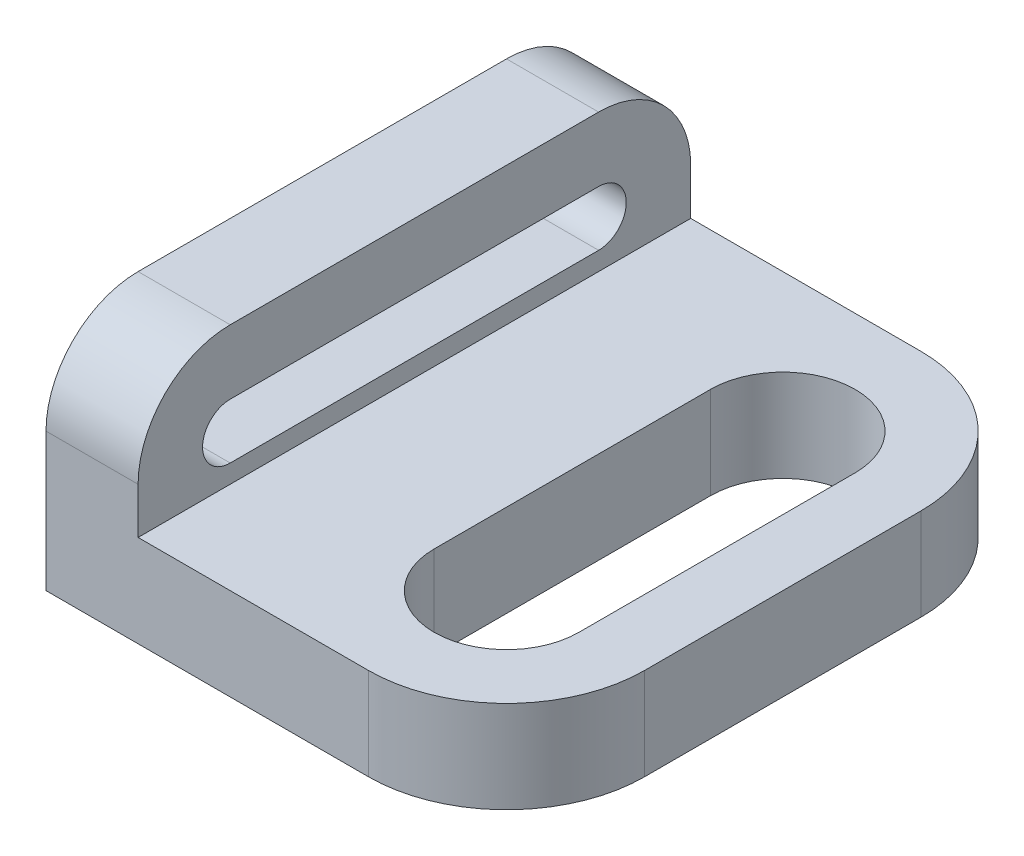
ISO-10303-21;
HEADER;
FILE_DESCRIPTION(('STEP AP214'),'2;1');
FILE_NAME('part.step','',(''),(''),'','','');
FILE_SCHEMA(('AUTOMOTIVE_DESIGN { 1 0 10303 214 1 1 1 1 }'));
ENDSEC;
DATA;
#1=APPLICATION_CONTEXT('core data for automotive mechanical design processes');
#2=APPLICATION_PROTOCOL_DEFINITION('international standard','automotive_design',2000,#1);
#3=PRODUCT_CONTEXT('',#1,'mechanical');
#4=PRODUCT('Part','Part','',(#3));
#5=PRODUCT_RELATED_PRODUCT_CATEGORY('part','',(#4));
#6=PRODUCT_DEFINITION_FORMATION('','',#4);
#7=PRODUCT_DEFINITION_CONTEXT('part definition',#1,'design');
#8=PRODUCT_DEFINITION('design','',#6,#7);
#9=PRODUCT_DEFINITION_SHAPE('','',#8);
#10=(LENGTH_UNIT() NAMED_UNIT(*) SI_UNIT(.MILLI.,.METRE.));
#11=(NAMED_UNIT(*) PLANE_ANGLE_UNIT() SI_UNIT($,.RADIAN.));
#12=(NAMED_UNIT(*) SI_UNIT($,.STERADIAN.) SOLID_ANGLE_UNIT());
#13=UNCERTAINTY_MEASURE_WITH_UNIT(LENGTH_MEASURE(1.E-05),#10,'distance_accuracy_value','');
#14=(GEOMETRIC_REPRESENTATION_CONTEXT(3) GLOBAL_UNCERTAINTY_ASSIGNED_CONTEXT((#13)) GLOBAL_UNIT_ASSIGNED_CONTEXT((#10,
#11,#12)) REPRESENTATION_CONTEXT('',''));
#15=CARTESIAN_POINT('',(0.,0.,0.));
#16=DIRECTION('',(0.,0.,1.));
#17=DIRECTION('',(1.,0.,0.));
#18=AXIS2_PLACEMENT_3D('',#15,#16,#17);
#19=CARTESIAN_POINT('',(0.,20.,-41.2149532710281));
#20=DIRECTION('',(0.,0.,-1.));
#21=DIRECTION('',(-1.,0.,0.));
#22=AXIS2_PLACEMENT_3D('',#19,#20,#21);
#23=PLANE('',#22);
#24=DIRECTION('',(0.,-1.,0.));
#25=VECTOR('',#24,1.);
#26=CARTESIAN_POINT('',(-64.018691588785,20.,-41.2149532710281));
#27=LINE('',#26,#25);
#28=CARTESIAN_POINT('',(-64.018691588785,30.,-41.2149532710281));
#29=VERTEX_POINT('',#28);
#30=CARTESIAN_POINT('',(-64.018691588785,0.,-41.2149532710281));
#31=VERTEX_POINT('',#30);
#32=EDGE_CURVE('E252',#29,#31,#27,.T.);
#33=ORIENTED_EDGE('',*,*,#32,.F.);
#34=DIRECTION('',(1.,0.,0.));
#35=VECTOR('',#34,1.);
#36=CARTESIAN_POINT('',(-44.018691588785,30.,-41.2149532710281));
#37=LINE('',#36,#35);
#38=CARTESIAN_POINT('',(-44.018691588785,30.,-41.2149532710281));
#39=VERTEX_POINT('',#38);
#40=EDGE_CURVE('E282',#29,#39,#37,.T.);
#41=ORIENTED_EDGE('',*,*,#40,.T.);
#42=DIRECTION('',(0.,-1.,0.));
#43=VECTOR('',#42,1.);
#44=CARTESIAN_POINT('',(-44.018691588785,50.,-41.2149532710281));
#45=LINE('',#44,#43);
#46=CARTESIAN_POINT('',(-44.018691588785,20.,-41.2149532710281));
#47=VERTEX_POINT('',#46);
#48=EDGE_CURVE('E202',#39,#47,#45,.T.);
#49=ORIENTED_EDGE('',*,*,#48,.T.);
#50=DIRECTION('',(1.,0.,0.));
#51=VECTOR('',#50,1.);
#52=CARTESIAN_POINT('',(0.,20.,-41.2149532710281));
#53=LINE('',#52,#51);
#54=CARTESIAN_POINT('',(5.98130841121499,20.,-41.2149532710281));
#55=VERTEX_POINT('',#54);
#56=EDGE_CURVE('E222',#47,#55,#53,.T.);
#57=ORIENTED_EDGE('',*,*,#56,.T.);
#58=DIRECTION('',(0.,-1.,0.));
#59=VECTOR('',#58,1.);
#60=CARTESIAN_POINT('',(5.98130841121499,20.,-41.2149532710281));
#61=LINE('',#60,#59);
#62=CARTESIAN_POINT('',(5.98130841121499,0.,-41.2149532710281));
#63=VERTEX_POINT('',#62);
#64=EDGE_CURVE('E255',#55,#63,#61,.T.);
#65=ORIENTED_EDGE('',*,*,#64,.T.);
#66=DIRECTION('',(1.,0.,0.));
#67=VECTOR('',#66,1.);
#68=CARTESIAN_POINT('',(0.,0.,-41.2149532710281));
#69=LINE('',#68,#67);
#70=EDGE_CURVE('E241',#31,#63,#69,.T.);
#71=ORIENTED_EDGE('',*,*,#70,.F.);
#72=EDGE_LOOP('',(#33,#41,#49,#57,#65,#71));
#73=FACE_BOUND('',#72,.T.);
#74=ADVANCED_FACE('F35',(#73),#23,.T.);
#75=CARTESIAN_POINT('',(-64.018691588785,20.,0.));
#76=DIRECTION('',(1.,0.,0.));
#77=DIRECTION('',(0.,0.,-1.));
#78=AXIS2_PLACEMENT_3D('',#75,#76,#77);
#79=PLANE('',#78);
#80=DIRECTION('',(0.,0.,-1.));
#81=VECTOR('',#80,1.);
#82=CARTESIAN_POINT('',(-64.018691588785,36.,58.7850467289719));
#83=LINE('',#82,#81);
#84=CARTESIAN_POINT('',(-64.018691588785,36.,58.7850467289719));
#85=VERTEX_POINT('',#84);
#86=CARTESIAN_POINT('',(-64.018691588785,36.,-21.2149532710281));
#87=VERTEX_POINT('',#86);
#88=EDGE_CURVE('E169',#85,#87,#83,.T.);
#89=ORIENTED_EDGE('',*,*,#88,.F.);
#90=CARTESIAN_POINT('',(-64.018691588785,30.,58.7850467289719));
#91=DIRECTION('',(1.,0.,0.));
#92=DIRECTION('',(0.,0.,-1.));
#93=AXIS2_PLACEMENT_3D('',#90,#91,#92);
#94=CIRCLE('',#93,6.);
#95=CARTESIAN_POINT('',(-64.018691588785,24.,58.7850467289719));
#96=VERTEX_POINT('',#95);
#97=EDGE_CURVE('E163',#85,#96,#94,.T.);
#98=ORIENTED_EDGE('',*,*,#97,.T.);
#99=DIRECTION('',(0.,0.,-1.));
#100=VECTOR('',#99,1.);
#101=CARTESIAN_POINT('',(-64.018691588785,24.,58.7850467289719));
#102=LINE('',#101,#100);
#103=CARTESIAN_POINT('',(-64.018691588785,24.,-21.2149532710281));
#104=VERTEX_POINT('',#103);
#105=EDGE_CURVE('E172',#96,#104,#102,.T.);
#106=ORIENTED_EDGE('',*,*,#105,.T.);
#107=CARTESIAN_POINT('',(-64.018691588785,30.,-21.2149532710281));
#108=DIRECTION('',(1.,0.,0.));
#109=DIRECTION('',(0.,0.,-1.));
#110=AXIS2_PLACEMENT_3D('',#107,#108,#109);
#111=CIRCLE('',#110,6.);
#112=EDGE_CURVE('E50',#104,#87,#111,.T.);
#113=ORIENTED_EDGE('',*,*,#112,.T.);
#114=EDGE_LOOP('',(#89,#98,#106,#113));
#115=FACE_BOUND('',#114,.T.);
#116=DIRECTION('',(0.,0.,1.));
#117=VECTOR('',#116,1.);
#118=CARTESIAN_POINT('',(-64.018691588785,50.,-41.2149532710281));
#119=LINE('',#118,#117);
#120=CARTESIAN_POINT('',(-64.018691588785,50.,-21.2149532710281));
#121=VERTEX_POINT('',#120);
#122=CARTESIAN_POINT('',(-64.018691588785,50.,58.7850467289719));
#123=VERTEX_POINT('',#122);
#124=EDGE_CURVE('E193',#121,#123,#119,.T.);
#125=ORIENTED_EDGE('',*,*,#124,.F.);
#126=CARTESIAN_POINT('',(-64.018691588785,30.,-21.2149532710281));
#127=DIRECTION('',(1.,0.,0.));
#128=DIRECTION('',(0.,0.,-1.));
#129=AXIS2_PLACEMENT_3D('',#126,#127,#128);
#130=CIRCLE('',#129,20.);
#131=EDGE_CURVE('E43',#121,#29,#130,.F.);
#132=ORIENTED_EDGE('',*,*,#131,.T.);
#133=ORIENTED_EDGE('',*,*,#32,.T.);
#134=DIRECTION('',(0.,0.,1.));
#135=VECTOR('',#134,1.);
#136=CARTESIAN_POINT('',(-64.018691588785,0.,0.));
#137=LINE('',#136,#135);
#138=CARTESIAN_POINT('',(-64.018691588785,0.,78.7850467289719));
#139=VERTEX_POINT('',#138);
#140=EDGE_CURVE('E243',#31,#139,#137,.T.);
#141=ORIENTED_EDGE('',*,*,#140,.T.);
#142=DIRECTION('',(0.,-1.,0.));
#143=VECTOR('',#142,1.);
#144=CARTESIAN_POINT('',(-64.018691588785,20.,78.7850467289719));
#145=LINE('',#144,#143);
#146=CARTESIAN_POINT('',(-64.018691588785,30.,78.7850467289719));
#147=VERTEX_POINT('',#146);
#148=EDGE_CURVE('E250',#147,#139,#145,.T.);
#149=ORIENTED_EDGE('',*,*,#148,.F.);
#150=CARTESIAN_POINT('',(-64.018691588785,30.,58.7850467289719));
#151=DIRECTION('',(1.,0.,0.));
#152=DIRECTION('',(0.,0.,-1.));
#153=AXIS2_PLACEMENT_3D('',#150,#151,#152);
#154=CIRCLE('',#153,20.);
#155=EDGE_CURVE('E293',#147,#123,#154,.F.);
#156=ORIENTED_EDGE('',*,*,#155,.T.);
#157=EDGE_LOOP('',(#125,#132,#133,#141,#149,#156));
#158=FACE_BOUND('',#157,.T.);
#159=ADVANCED_FACE('F176',(#115,#158),#79,.F.);
#160=CARTESIAN_POINT('',(0.,20.,78.7850467289719));
#161=DIRECTION('',(0.,0.,-1.));
#162=DIRECTION('',(-1.,0.,0.));
#163=AXIS2_PLACEMENT_3D('',#160,#161,#162);
#164=PLANE('',#163);
#165=DIRECTION('',(0.,-1.,0.));
#166=VECTOR('',#165,1.);
#167=CARTESIAN_POINT('',(-44.018691588785,50.,78.7850467289719));
#168=LINE('',#167,#166);
#169=CARTESIAN_POINT('',(-44.018691588785,30.,78.7850467289719));
#170=VERTEX_POINT('',#169);
#171=CARTESIAN_POINT('',(-44.018691588785,20.,78.7850467289719));
#172=VERTEX_POINT('',#171);
#173=EDGE_CURVE('E204',#170,#172,#168,.T.);
#174=ORIENTED_EDGE('',*,*,#173,.F.);
#175=DIRECTION('',(-1.,0.,0.));
#176=VECTOR('',#175,1.);
#177=CARTESIAN_POINT('',(0.,30.,78.7850467289719));
#178=LINE('',#177,#176);
#179=EDGE_CURVE('E11',#170,#147,#178,.T.);
#180=ORIENTED_EDGE('',*,*,#179,.T.);
#181=ORIENTED_EDGE('',*,*,#148,.T.);
#182=DIRECTION('',(1.,0.,0.));
#183=VECTOR('',#182,1.);
#184=CARTESIAN_POINT('',(0.,0.,78.7850467289719));
#185=LINE('',#184,#183);
#186=CARTESIAN_POINT('',(5.981308411215,0.,78.7850467289719));
#187=VERTEX_POINT('',#186);
#188=EDGE_CURVE('E246',#139,#187,#185,.T.);
#189=ORIENTED_EDGE('',*,*,#188,.T.);
#190=DIRECTION('',(0.,-1.,0.));
#191=VECTOR('',#190,1.);
#192=CARTESIAN_POINT('',(5.981308411215,20.,78.7850467289719));
#193=LINE('',#192,#191);
#194=CARTESIAN_POINT('',(5.981308411215,20.,78.7850467289719));
#195=VERTEX_POINT('',#194);
#196=EDGE_CURVE('E279',#187,#195,#193,.F.);
#197=ORIENTED_EDGE('',*,*,#196,.T.);
#198=DIRECTION('',(1.,0.,0.));
#199=VECTOR('',#198,1.);
#200=CARTESIAN_POINT('',(0.,20.,78.7850467289719));
#201=LINE('',#200,#199);
#202=EDGE_CURVE('E224',#172,#195,#201,.T.);
#203=ORIENTED_EDGE('',*,*,#202,.F.);
#204=EDGE_LOOP('',(#174,#180,#181,#189,#197,#203));
#205=FACE_BOUND('',#204,.T.);
#206=ADVANCED_FACE('F318',(#205),#164,.F.);
#207=CARTESIAN_POINT('',(5.98130841121497,20.,48.7850467289719));
#208=DIRECTION('',(0.,-1.,0.));
#209=DIRECTION('',(0.,0.,-1.));
#210=AXIS2_PLACEMENT_3D('',#207,#208,#209);
#211=CYLINDRICAL_SURFACE('',#210,15.7009345794392);
#212=CARTESIAN_POINT('',(5.98130841121497,0.,48.7850467289719));
#213=DIRECTION('',(0.,1.,0.));
#214=DIRECTION('',(0.,0.,1.));
#215=AXIS2_PLACEMENT_3D('',#212,#213,#214);
#216=CIRCLE('',#215,15.7009345794392);
#217=CARTESIAN_POINT('',(-9.71962616822425,0.,48.7850467289719));
#218=VERTEX_POINT('',#217);
#219=CARTESIAN_POINT('',(21.6822429906542,0.,48.7850467289719));
#220=VERTEX_POINT('',#219);
#221=EDGE_CURVE('E209',#218,#220,#216,.T.);
#222=ORIENTED_EDGE('',*,*,#221,.F.);
#223=DIRECTION('',(0.,-1.,0.));
#224=VECTOR('',#223,1.);
#225=CARTESIAN_POINT('',(-9.71962616822425,20.,48.7850467289719));
#226=LINE('',#225,#224);
#227=CARTESIAN_POINT('',(-9.71962616822425,20.,48.7850467289719));
#228=VERTEX_POINT('',#227);
#229=EDGE_CURVE('E253',#228,#218,#226,.T.);
#230=ORIENTED_EDGE('',*,*,#229,.F.);
#231=CARTESIAN_POINT('',(5.98130841121497,20.,48.7850467289719));
#232=DIRECTION('',(0.,1.,0.));
#233=DIRECTION('',(0.,0.,1.));
#234=AXIS2_PLACEMENT_3D('',#231,#232,#233);
#235=CIRCLE('',#234,15.7009345794392);
#236=CARTESIAN_POINT('',(21.6822429906542,20.,48.7850467289719));
#237=VERTEX_POINT('',#236);
#238=EDGE_CURVE('E210',#228,#237,#235,.T.);
#239=ORIENTED_EDGE('',*,*,#238,.T.);
#240=DIRECTION('',(0.,-1.,0.));
#241=VECTOR('',#240,1.);
#242=CARTESIAN_POINT('',(21.6822429906542,20.,48.7850467289719));
#243=LINE('',#242,#241);
#244=EDGE_CURVE('E229',#237,#220,#243,.T.);
#245=ORIENTED_EDGE('',*,*,#244,.T.);
#246=EDGE_LOOP('',(#222,#230,#239,#245));
#247=FACE_BOUND('',#246,.T.);
#248=ADVANCED_FACE('F370',(#247),#211,.F.);
#249=CARTESIAN_POINT('',(-9.71962616822424,20.,0.));
#250=DIRECTION('',(1.,0.,0.));
#251=DIRECTION('',(0.,0.,-1.));
#252=AXIS2_PLACEMENT_3D('',#249,#250,#251);
#253=PLANE('',#252);
#254=DIRECTION('',(0.,0.,1.));
#255=VECTOR('',#254,1.);
#256=CARTESIAN_POINT('',(-9.71962616822424,0.,0.));
#257=LINE('',#256,#255);
#258=CARTESIAN_POINT('',(-9.71962616822424,0.,-11.2149532710281));
#259=VERTEX_POINT('',#258);
#260=EDGE_CURVE('E232',#259,#218,#257,.T.);
#261=ORIENTED_EDGE('',*,*,#260,.F.);
#262=DIRECTION('',(0.,-1.,0.));
#263=VECTOR('',#262,1.);
#264=CARTESIAN_POINT('',(-9.71962616822424,20.,-11.2149532710281));
#265=LINE('',#264,#263);
#266=CARTESIAN_POINT('',(-9.71962616822424,20.,-11.2149532710281));
#267=VERTEX_POINT('',#266);
#268=EDGE_CURVE('E259',#267,#259,#265,.T.);
#269=ORIENTED_EDGE('',*,*,#268,.F.);
#270=DIRECTION('',(0.,0.,1.));
#271=VECTOR('',#270,1.);
#272=CARTESIAN_POINT('',(-9.71962616822424,20.,0.));
#273=LINE('',#272,#271);
#274=EDGE_CURVE('E213',#267,#228,#273,.T.);
#275=ORIENTED_EDGE('',*,*,#274,.T.);
#276=ORIENTED_EDGE('',*,*,#229,.T.);
#277=EDGE_LOOP('',(#261,#269,#275,#276));
#278=FACE_BOUND('',#277,.T.);
#279=ADVANCED_FACE('F366',(#278),#253,.T.);
#280=CARTESIAN_POINT('',(5.98130841121497,20.,-11.2149532710281));
#281=DIRECTION('',(0.,-1.,0.));
#282=DIRECTION('',(0.,0.,-1.));
#283=AXIS2_PLACEMENT_3D('',#280,#281,#282);
#284=CYLINDRICAL_SURFACE('',#283,15.7009345794392);
#285=CARTESIAN_POINT('',(5.98130841121497,0.,-11.2149532710281));
#286=DIRECTION('',(0.,1.,0.));
#287=DIRECTION('',(0.,0.,1.));
#288=AXIS2_PLACEMENT_3D('',#285,#286,#287);
#289=CIRCLE('',#288,15.7009345794392);
#290=CARTESIAN_POINT('',(21.6822429906542,0.,-11.2149532710281));
#291=VERTEX_POINT('',#290);
#292=EDGE_CURVE('E235',#291,#259,#289,.T.);
#293=ORIENTED_EDGE('',*,*,#292,.F.);
#294=DIRECTION('',(0.,-1.,0.));
#295=VECTOR('',#294,1.);
#296=CARTESIAN_POINT('',(21.6822429906542,20.,-11.2149532710281));
#297=LINE('',#296,#295);
#298=CARTESIAN_POINT('',(21.6822429906542,20.,-11.2149532710281));
#299=VERTEX_POINT('',#298);
#300=EDGE_CURVE('E257',#299,#291,#297,.T.);
#301=ORIENTED_EDGE('',*,*,#300,.F.);
#302=CARTESIAN_POINT('',(5.98130841121497,20.,-11.2149532710281));
#303=DIRECTION('',(0.,1.,0.));
#304=DIRECTION('',(0.,0.,1.));
#305=AXIS2_PLACEMENT_3D('',#302,#303,#304);
#306=CIRCLE('',#305,15.7009345794392);
#307=EDGE_CURVE('E217',#299,#267,#306,.T.);
#308=ORIENTED_EDGE('',*,*,#307,.T.);
#309=ORIENTED_EDGE('',*,*,#268,.T.);
#310=EDGE_LOOP('',(#293,#301,#308,#309));
#311=FACE_BOUND('',#310,.T.);
#312=ADVANCED_FACE('F362',(#311),#284,.F.);
#313=CARTESIAN_POINT('',(21.6822429906542,20.,0.));
#314=DIRECTION('',(1.,0.,0.));
#315=DIRECTION('',(0.,0.,-1.));
#316=AXIS2_PLACEMENT_3D('',#313,#314,#315);
#317=PLANE('',#316);
#318=DIRECTION('',(0.,0.,1.));
#319=VECTOR('',#318,1.);
#320=CARTESIAN_POINT('',(21.6822429906542,0.,0.));
#321=LINE('',#320,#319);
#322=EDGE_CURVE('E238',#291,#220,#321,.T.);
#323=ORIENTED_EDGE('',*,*,#322,.T.);
#324=ORIENTED_EDGE('',*,*,#244,.F.);
#325=DIRECTION('',(0.,0.,1.));
#326=VECTOR('',#325,1.);
#327=CARTESIAN_POINT('',(21.6822429906542,20.,0.));
#328=LINE('',#327,#326);
#329=EDGE_CURVE('E220',#299,#237,#328,.T.);
#330=ORIENTED_EDGE('',*,*,#329,.F.);
#331=ORIENTED_EDGE('',*,*,#300,.T.);
#332=EDGE_LOOP('',(#323,#324,#330,#331));
#333=FACE_BOUND('',#332,.T.);
#334=ADVANCED_FACE('F359',(#333),#317,.F.);
#335=CARTESIAN_POINT('',(35.981308411215,20.,0.));
#336=DIRECTION('',(1.,0.,0.));
#337=DIRECTION('',(0.,0.,-1.));
#338=AXIS2_PLACEMENT_3D('',#335,#336,#337);
#339=PLANE('',#338);
#340=DIRECTION('',(0.,0.,1.));
#341=VECTOR('',#340,1.);
#342=CARTESIAN_POINT('',(35.981308411215,0.,0.));
#343=LINE('',#342,#341);
#344=CARTESIAN_POINT('',(35.981308411215,0.,-11.2149532710281));
#345=VERTEX_POINT('',#344);
#346=CARTESIAN_POINT('',(35.981308411215,0.,48.7850467289719));
#347=VERTEX_POINT('',#346);
#348=EDGE_CURVE('E214',#345,#347,#343,.T.);
#349=ORIENTED_EDGE('',*,*,#348,.F.);
#350=DIRECTION('',(0.,-1.,0.));
#351=VECTOR('',#350,1.);
#352=CARTESIAN_POINT('',(35.981308411215,20.,-11.2149532710281));
#353=LINE('',#352,#351);
#354=CARTESIAN_POINT('',(35.981308411215,20.,-11.2149532710281));
#355=VERTEX_POINT('',#354);
#356=EDGE_CURVE('E272',#345,#355,#353,.F.);
#357=ORIENTED_EDGE('',*,*,#356,.T.);
#358=DIRECTION('',(0.,0.,1.));
#359=VECTOR('',#358,1.);
#360=CARTESIAN_POINT('',(35.981308411215,20.,0.));
#361=LINE('',#360,#359);
#362=CARTESIAN_POINT('',(35.981308411215,20.,48.7850467289719));
#363=VERTEX_POINT('',#362);
#364=EDGE_CURVE('E226',#355,#363,#361,.T.);
#365=ORIENTED_EDGE('',*,*,#364,.T.);
#366=DIRECTION('',(0.,-1.,0.));
#367=VECTOR('',#366,1.);
#368=CARTESIAN_POINT('',(35.981308411215,0.,48.7850467289719));
#369=LINE('',#368,#367);
#370=EDGE_CURVE('E269',#363,#347,#369,.T.);
#371=ORIENTED_EDGE('',*,*,#370,.T.);
#372=EDGE_LOOP('',(#349,#357,#365,#371));
#373=FACE_BOUND('',#372,.T.);
#374=ADVANCED_FACE('F337',(#373),#339,.T.);
#375=CARTESIAN_POINT('',(0.,20.,0.));
#376=DIRECTION('',(0.,1.,0.));
#377=DIRECTION('',(0.,0.,1.));
#378=AXIS2_PLACEMENT_3D('',#375,#376,#377);
#379=PLANE('',#378);
#380=DIRECTION('',(0.,0.,-1.));
#381=VECTOR('',#380,1.);
#382=CARTESIAN_POINT('',(-44.018691588785,20.,0.));
#383=LINE('',#382,#381);
#384=EDGE_CURVE('E206',#172,#47,#383,.T.);
#385=ORIENTED_EDGE('',*,*,#384,.F.);
#386=ORIENTED_EDGE('',*,*,#202,.T.);
#387=CARTESIAN_POINT('',(5.981308411215,20.,48.7850467289719));
#388=DIRECTION('',(0.,1.,0.));
#389=DIRECTION('',(0.,0.,1.));
#390=AXIS2_PLACEMENT_3D('',#387,#388,#389);
#391=CIRCLE('',#390,30.);
#392=EDGE_CURVE('E274',#195,#363,#391,.T.);
#393=ORIENTED_EDGE('',*,*,#392,.T.);
#394=ORIENTED_EDGE('',*,*,#364,.F.);
#395=CARTESIAN_POINT('',(5.98130841121499,20.,-11.2149532710281));
#396=DIRECTION('',(0.,1.,0.));
#397=DIRECTION('',(0.,0.,1.));
#398=AXIS2_PLACEMENT_3D('',#395,#396,#397);
#399=CIRCLE('',#398,30.);
#400=EDGE_CURVE('E276',#355,#55,#399,.T.);
#401=ORIENTED_EDGE('',*,*,#400,.T.);
#402=ORIENTED_EDGE('',*,*,#56,.F.);
#403=EDGE_LOOP('',(#385,#386,#393,#394,#401,#402));
#404=FACE_BOUND('',#403,.T.);
#405=ORIENTED_EDGE('',*,*,#238,.F.);
#406=ORIENTED_EDGE('',*,*,#274,.F.);
#407=ORIENTED_EDGE('',*,*,#307,.F.);
#408=ORIENTED_EDGE('',*,*,#329,.T.);
#409=EDGE_LOOP('',(#405,#406,#407,#408));
#410=FACE_BOUND('',#409,.T.);
#411=ADVANCED_FACE('F323',(#404,#410),#379,.T.);
#412=CARTESIAN_POINT('',(0.,0.,0.));
#413=DIRECTION('',(0.,1.,0.));
#414=DIRECTION('',(0.,0.,1.));
#415=AXIS2_PLACEMENT_3D('',#412,#413,#414);
#416=PLANE('',#415);
#417=ORIENTED_EDGE('',*,*,#221,.T.);
#418=ORIENTED_EDGE('',*,*,#322,.F.);
#419=ORIENTED_EDGE('',*,*,#292,.T.);
#420=ORIENTED_EDGE('',*,*,#260,.T.);
#421=EDGE_LOOP('',(#417,#418,#419,#420));
#422=FACE_BOUND('',#421,.T.);
#423=CARTESIAN_POINT('',(5.981308411215,0.,48.7850467289719));
#424=DIRECTION('',(0.,1.,0.));
#425=DIRECTION('',(0.,0.,1.));
#426=AXIS2_PLACEMENT_3D('',#423,#424,#425);
#427=CIRCLE('',#426,30.);
#428=EDGE_CURVE('E264',#347,#187,#427,.F.);
#429=ORIENTED_EDGE('',*,*,#428,.T.);
#430=ORIENTED_EDGE('',*,*,#188,.F.);
#431=ORIENTED_EDGE('',*,*,#140,.F.);
#432=ORIENTED_EDGE('',*,*,#70,.T.);
#433=CARTESIAN_POINT('',(5.98130841121499,0.,-11.2149532710281));
#434=DIRECTION('',(0.,1.,0.));
#435=DIRECTION('',(0.,0.,1.));
#436=AXIS2_PLACEMENT_3D('',#433,#434,#435);
#437=CIRCLE('',#436,30.);
#438=EDGE_CURVE('E267',#63,#345,#437,.F.);
#439=ORIENTED_EDGE('',*,*,#438,.T.);
#440=ORIENTED_EDGE('',*,*,#348,.T.);
#441=EDGE_LOOP('',(#429,#430,#431,#432,#439,#440));
#442=FACE_BOUND('',#441,.T.);
#443=ADVANCED_FACE('F335',(#422,#442),#416,.F.);
#444=CARTESIAN_POINT('',(5.98130841121499,20.,-11.2149532710281));
#445=DIRECTION('',(0.,-1.,0.));
#446=DIRECTION('',(0.,0.,-1.));
#447=AXIS2_PLACEMENT_3D('',#444,#445,#446);
#448=CYLINDRICAL_SURFACE('',#447,30.);
#449=ORIENTED_EDGE('',*,*,#400,.F.);
#450=ORIENTED_EDGE('',*,*,#356,.F.);
#451=ORIENTED_EDGE('',*,*,#438,.F.);
#452=ORIENTED_EDGE('',*,*,#64,.F.);
#453=EDGE_LOOP('',(#449,#450,#451,#452));
#454=FACE_BOUND('',#453,.T.);
#455=ADVANCED_FACE('F331',(#454),#448,.T.);
#456=CARTESIAN_POINT('',(5.981308411215,20.,48.7850467289719));
#457=DIRECTION('',(0.,1.,0.));
#458=DIRECTION('',(0.,0.,1.));
#459=AXIS2_PLACEMENT_3D('',#456,#457,#458);
#460=CYLINDRICAL_SURFACE('',#459,30.);
#461=ORIENTED_EDGE('',*,*,#392,.F.);
#462=ORIENTED_EDGE('',*,*,#196,.F.);
#463=ORIENTED_EDGE('',*,*,#428,.F.);
#464=ORIENTED_EDGE('',*,*,#370,.F.);
#465=EDGE_LOOP('',(#461,#462,#463,#464));
#466=FACE_BOUND('',#465,.T.);
#467=ADVANCED_FACE('F340',(#466),#460,.T.);
#468=CARTESIAN_POINT('',(-44.018691588785,50.,-41.2149532710281));
#469=DIRECTION('',(1.,0.,0.));
#470=DIRECTION('',(0.,0.,-1.));
#471=AXIS2_PLACEMENT_3D('',#468,#469,#470);
#472=PLANE('',#471);
#473=CARTESIAN_POINT('',(-44.018691588785,30.,58.7850467289719));
#474=DIRECTION('',(1.,0.,0.));
#475=DIRECTION('',(0.,0.,-1.));
#476=AXIS2_PLACEMENT_3D('',#473,#474,#475);
#477=CIRCLE('',#476,6.);
#478=CARTESIAN_POINT('',(-44.018691588785,36.,58.7850467289719));
#479=VERTEX_POINT('',#478);
#480=CARTESIAN_POINT('',(-44.018691588785,24.,58.7850467289719));
#481=VERTEX_POINT('',#480);
#482=EDGE_CURVE('E58',#479,#481,#477,.T.);
#483=ORIENTED_EDGE('',*,*,#482,.F.);
#484=DIRECTION('',(0.,0.,-1.));
#485=VECTOR('',#484,1.);
#486=CARTESIAN_POINT('',(-44.018691588785,36.,58.7850467289719));
#487=LINE('',#486,#485);
#488=CARTESIAN_POINT('',(-44.018691588785,36.,-21.2149532710281));
#489=VERTEX_POINT('',#488);
#490=EDGE_CURVE('E178',#479,#489,#487,.T.);
#491=ORIENTED_EDGE('',*,*,#490,.T.);
#492=CARTESIAN_POINT('',(-44.018691588785,30.,-21.2149532710281));
#493=DIRECTION('',(1.,0.,0.));
#494=DIRECTION('',(0.,0.,-1.));
#495=AXIS2_PLACEMENT_3D('',#492,#493,#494);
#496=CIRCLE('',#495,6.);
#497=CARTESIAN_POINT('',(-44.018691588785,24.,-21.2149532710281));
#498=VERTEX_POINT('',#497);
#499=EDGE_CURVE('E181',#498,#489,#496,.T.);
#500=ORIENTED_EDGE('',*,*,#499,.F.);
#501=DIRECTION('',(0.,0.,-1.));
#502=VECTOR('',#501,1.);
#503=CARTESIAN_POINT('',(-44.018691588785,24.,58.7850467289719));
#504=LINE('',#503,#502);
#505=EDGE_CURVE('E187',#481,#498,#504,.T.);
#506=ORIENTED_EDGE('',*,*,#505,.F.);
#507=EDGE_LOOP('',(#483,#491,#500,#506));
#508=FACE_BOUND('',#507,.T.);
#509=ORIENTED_EDGE('',*,*,#48,.F.);
#510=CARTESIAN_POINT('',(-44.018691588785,30.,-21.2149532710281));
#511=DIRECTION('',(1.,0.,0.));
#512=DIRECTION('',(0.,0.,-1.));
#513=AXIS2_PLACEMENT_3D('',#510,#511,#512);
#514=CIRCLE('',#513,20.);
#515=CARTESIAN_POINT('',(-44.018691588785,50.,-21.2149532710281));
#516=VERTEX_POINT('',#515);
#517=EDGE_CURVE('E287',#39,#516,#514,.T.);
#518=ORIENTED_EDGE('',*,*,#517,.T.);
#519=DIRECTION('',(0.,0.,1.));
#520=VECTOR('',#519,1.);
#521=CARTESIAN_POINT('',(-44.018691588785,50.,-41.2149532710281));
#522=LINE('',#521,#520);
#523=CARTESIAN_POINT('',(-44.018691588785,50.,58.7850467289719));
#524=VERTEX_POINT('',#523);
#525=EDGE_CURVE('E199',#516,#524,#522,.T.);
#526=ORIENTED_EDGE('',*,*,#525,.T.);
#527=CARTESIAN_POINT('',(-44.018691588785,30.,58.7850467289719));
#528=DIRECTION('',(1.,0.,0.));
#529=DIRECTION('',(0.,0.,-1.));
#530=AXIS2_PLACEMENT_3D('',#527,#528,#529);
#531=CIRCLE('',#530,20.);
#532=EDGE_CURVE('E285',#524,#170,#531,.T.);
#533=ORIENTED_EDGE('',*,*,#532,.T.);
#534=ORIENTED_EDGE('',*,*,#173,.T.);
#535=ORIENTED_EDGE('',*,*,#384,.T.);
#536=EDGE_LOOP('',(#509,#518,#526,#533,#534,#535));
#537=FACE_BOUND('',#536,.T.);
#538=ADVANCED_FACE('F307',(#508,#537),#472,.T.);
#539=CARTESIAN_POINT('',(0.,50.,0.));
#540=DIRECTION('',(0.,-1.,0.));
#541=DIRECTION('',(-1.,0.,0.));
#542=AXIS2_PLACEMENT_3D('',#539,#540,#541);
#543=PLANE('',#542);
#544=ORIENTED_EDGE('',*,*,#525,.F.);
#545=DIRECTION('',(1.,0.,0.));
#546=VECTOR('',#545,1.);
#547=CARTESIAN_POINT('',(-64.018691588785,50.,-21.2149532710281));
#548=LINE('',#547,#546);
#549=EDGE_CURVE('E291',#516,#121,#548,.F.);
#550=ORIENTED_EDGE('',*,*,#549,.T.);
#551=ORIENTED_EDGE('',*,*,#124,.T.);
#552=DIRECTION('',(-1.,0.,0.));
#553=VECTOR('',#552,1.);
#554=CARTESIAN_POINT('',(0.,50.,58.7850467289719));
#555=LINE('',#554,#553);
#556=EDGE_CURVE('E289',#123,#524,#555,.F.);
#557=ORIENTED_EDGE('',*,*,#556,.T.);
#558=EDGE_LOOP('',(#544,#550,#551,#557));
#559=FACE_BOUND('',#558,.T.);
#560=ADVANCED_FACE('F310',(#559),#543,.F.);
#561=CARTESIAN_POINT('',(0.,30.,-21.2149532710281));
#562=DIRECTION('',(-1.,0.,0.));
#563=DIRECTION('',(0.,0.,1.));
#564=AXIS2_PLACEMENT_3D('',#561,#562,#563);
#565=CYLINDRICAL_SURFACE('',#564,20.);
#566=ORIENTED_EDGE('',*,*,#131,.F.);
#567=ORIENTED_EDGE('',*,*,#549,.F.);
#568=ORIENTED_EDGE('',*,*,#517,.F.);
#569=ORIENTED_EDGE('',*,*,#40,.F.);
#570=EDGE_LOOP('',(#566,#567,#568,#569));
#571=FACE_BOUND('',#570,.T.);
#572=ADVANCED_FACE('F304',(#571),#565,.T.);
#573=CARTESIAN_POINT('',(0.,30.,58.7850467289719));
#574=DIRECTION('',(-1.,0.,0.));
#575=DIRECTION('',(0.,0.,1.));
#576=AXIS2_PLACEMENT_3D('',#573,#574,#575);
#577=CYLINDRICAL_SURFACE('',#576,20.);
#578=ORIENTED_EDGE('',*,*,#532,.F.);
#579=ORIENTED_EDGE('',*,*,#556,.F.);
#580=ORIENTED_EDGE('',*,*,#155,.F.);
#581=ORIENTED_EDGE('',*,*,#179,.F.);
#582=EDGE_LOOP('',(#578,#579,#580,#581));
#583=FACE_BOUND('',#582,.T.);
#584=ADVANCED_FACE('F37',(#583),#577,.T.);
#585=CARTESIAN_POINT('',(-64.018691588785,30.,58.7850467289719));
#586=DIRECTION('',(1.,0.,0.));
#587=DIRECTION('',(0.,0.,-1.));
#588=AXIS2_PLACEMENT_3D('',#585,#586,#587);
#589=CYLINDRICAL_SURFACE('',#588,6.);
#590=ORIENTED_EDGE('',*,*,#482,.T.);
#591=DIRECTION('',(1.,0.,0.));
#592=VECTOR('',#591,1.);
#593=CARTESIAN_POINT('',(-64.018691588785,24.,58.7850467289719));
#594=LINE('',#593,#592);
#595=EDGE_CURVE('E159',#96,#481,#594,.T.);
#596=ORIENTED_EDGE('',*,*,#595,.F.);
#597=ORIENTED_EDGE('',*,*,#97,.F.);
#598=DIRECTION('',(1.,0.,0.));
#599=VECTOR('',#598,1.);
#600=CARTESIAN_POINT('',(-64.018691588785,36.,58.7850467289719));
#601=LINE('',#600,#599);
#602=EDGE_CURVE('E191',#85,#479,#601,.T.);
#603=ORIENTED_EDGE('',*,*,#602,.T.);
#604=EDGE_LOOP('',(#590,#596,#597,#603));
#605=FACE_BOUND('',#604,.T.);
#606=ADVANCED_FACE('F161',(#605),#589,.F.);
#607=CARTESIAN_POINT('',(-64.018691588785,36.,58.7850467289719));
#608=DIRECTION('',(0.,-1.,0.));
#609=DIRECTION('',(0.,0.,-1.));
#610=AXIS2_PLACEMENT_3D('',#607,#608,#609);
#611=PLANE('',#610);
#612=ORIENTED_EDGE('',*,*,#490,.F.);
#613=ORIENTED_EDGE('',*,*,#602,.F.);
#614=ORIENTED_EDGE('',*,*,#88,.T.);
#615=DIRECTION('',(1.,0.,0.));
#616=VECTOR('',#615,1.);
#617=CARTESIAN_POINT('',(-64.018691588785,36.,-21.2149532710281));
#618=LINE('',#617,#616);
#619=EDGE_CURVE('E194',#87,#489,#618,.T.);
#620=ORIENTED_EDGE('',*,*,#619,.T.);
#621=EDGE_LOOP('',(#612,#613,#614,#620));
#622=FACE_BOUND('',#621,.T.);
#623=ADVANCED_FACE('F400',(#622),#611,.T.);
#624=CARTESIAN_POINT('',(-64.018691588785,30.,-21.2149532710281));
#625=DIRECTION('',(1.,0.,0.));
#626=DIRECTION('',(0.,0.,-1.));
#627=AXIS2_PLACEMENT_3D('',#624,#625,#626);
#628=CYLINDRICAL_SURFACE('',#627,6.);
#629=ORIENTED_EDGE('',*,*,#499,.T.);
#630=ORIENTED_EDGE('',*,*,#619,.F.);
#631=ORIENTED_EDGE('',*,*,#112,.F.);
#632=DIRECTION('',(1.,0.,0.));
#633=VECTOR('',#632,1.);
#634=CARTESIAN_POINT('',(-64.018691588785,24.,-21.2149532710281));
#635=LINE('',#634,#633);
#636=EDGE_CURVE('E168',#104,#498,#635,.T.);
#637=ORIENTED_EDGE('',*,*,#636,.T.);
#638=EDGE_LOOP('',(#629,#630,#631,#637));
#639=FACE_BOUND('',#638,.T.);
#640=ADVANCED_FACE('F403',(#639),#628,.F.);
#641=CARTESIAN_POINT('',(-64.018691588785,24.,58.7850467289719));
#642=DIRECTION('',(0.,-1.,0.));
#643=DIRECTION('',(0.,0.,-1.));
#644=AXIS2_PLACEMENT_3D('',#641,#642,#643);
#645=PLANE('',#644);
#646=ORIENTED_EDGE('',*,*,#505,.T.);
#647=ORIENTED_EDGE('',*,*,#636,.F.);
#648=ORIENTED_EDGE('',*,*,#105,.F.);
#649=ORIENTED_EDGE('',*,*,#595,.T.);
#650=EDGE_LOOP('',(#646,#647,#648,#649));
#651=FACE_BOUND('',#650,.T.);
#652=ADVANCED_FACE('F173',(#651),#645,.F.);
#653=CLOSED_SHELL('',(#74,#159,#206,#248,#279,#312,#334,#374,#411,#443,#455,#467,#538,#560,#572,
#584,#606,#623,#640,#652));
#654=MANIFOLD_SOLID_BREP('B2',#653);
#655=ADVANCED_BREP_SHAPE_REPRESENTATION('',(#18,#654),#14);
#656=SHAPE_DEFINITION_REPRESENTATION(#9,#655);
ENDSEC;
END-ISO-10303-21;
